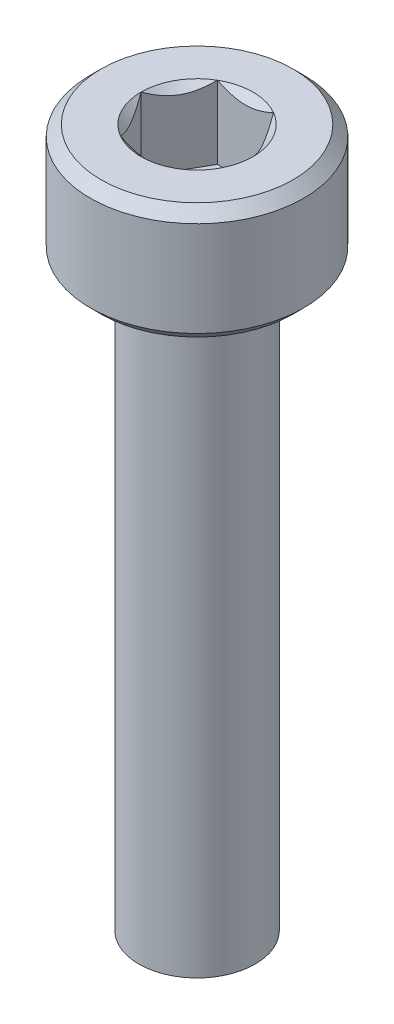
ISO-10303-21;
HEADER;
FILE_DESCRIPTION(('STEP AP214'),'2;1');
FILE_NAME('part.step','',(''),(''),'','','');
FILE_SCHEMA(('AUTOMOTIVE_DESIGN { 1 0 10303 214 1 1 1 1 }'));
ENDSEC;
DATA;
#1=APPLICATION_CONTEXT('core data for automotive mechanical design processes');
#2=APPLICATION_PROTOCOL_DEFINITION('international standard','automotive_design',2000,#1);
#3=PRODUCT_CONTEXT('',#1,'mechanical');
#4=PRODUCT('Part','Part','',(#3));
#5=PRODUCT_RELATED_PRODUCT_CATEGORY('part','',(#4));
#6=PRODUCT_DEFINITION_FORMATION('','',#4);
#7=PRODUCT_DEFINITION_CONTEXT('part definition',#1,'design');
#8=PRODUCT_DEFINITION('design','',#6,#7);
#9=PRODUCT_DEFINITION_SHAPE('','',#8);
#10=(LENGTH_UNIT() NAMED_UNIT(*) SI_UNIT(.MILLI.,.METRE.));
#11=(NAMED_UNIT(*) PLANE_ANGLE_UNIT() SI_UNIT($,.RADIAN.));
#12=(NAMED_UNIT(*) SI_UNIT($,.STERADIAN.) SOLID_ANGLE_UNIT());
#13=UNCERTAINTY_MEASURE_WITH_UNIT(LENGTH_MEASURE(1.E-05),#10,'distance_accuracy_value','');
#14=(GEOMETRIC_REPRESENTATION_CONTEXT(3) GLOBAL_UNCERTAINTY_ASSIGNED_CONTEXT((#13)) GLOBAL_UNIT_ASSIGNED_CONTEXT((#10,
#11,#12)) REPRESENTATION_CONTEXT('',''));
#15=CARTESIAN_POINT('',(0.,0.,0.));
#16=DIRECTION('',(0.,0.,1.));
#17=DIRECTION('',(1.,0.,0.));
#18=AXIS2_PLACEMENT_3D('',#15,#16,#17);
#19=CARTESIAN_POINT('',(0.,3.,0.));
#20=DIRECTION('',(0.,-1.,0.));
#21=DIRECTION('',(0.,0.,1.));
#22=AXIS2_PLACEMENT_3D('',#19,#20,#21);
#23=CYLINDRICAL_SURFACE('',#22,2.75);
#24=CARTESIAN_POINT('',(0.,0.275000000000001,0.));
#25=DIRECTION('',(0.,-1.,0.));
#26=DIRECTION('',(0.,0.,-1.));
#27=AXIS2_PLACEMENT_3D('',#24,#25,#26);
#28=CIRCLE('',#27,2.75);
#29=CARTESIAN_POINT('',(0.,0.275000000000001,-2.75));
#30=VERTEX_POINT('',#29);
#31=EDGE_CURVE('E177',#30,#30,#28,.T.);
#32=ORIENTED_EDGE('',*,*,#31,.F.);
#33=EDGE_LOOP('',(#32));
#34=FACE_BOUND('',#33,.T.);
#35=CARTESIAN_POINT('',(0.,2.725,0.));
#36=DIRECTION('',(0.,-1.,0.));
#37=DIRECTION('',(0.,0.,-1.));
#38=AXIS2_PLACEMENT_3D('',#35,#36,#37);
#39=CIRCLE('',#38,2.75);
#40=CARTESIAN_POINT('',(0.,2.725,-2.75));
#41=VERTEX_POINT('',#40);
#42=EDGE_CURVE('E120',#41,#41,#39,.F.);
#43=ORIENTED_EDGE('',*,*,#42,.F.);
#44=EDGE_LOOP('',(#43));
#45=FACE_BOUND('',#44,.T.);
#46=ADVANCED_FACE('F37',(#34,#45),#23,.T.);
#47=CARTESIAN_POINT('',(0.,3.,0.));
#48=DIRECTION('',(0.,1.,0.));
#49=DIRECTION('',(0.,0.,-1.));
#50=AXIS2_PLACEMENT_3D('',#47,#48,#49);
#51=PLANE('',#50);
#52=CARTESIAN_POINT('',(0.,3.,0.));
#53=DIRECTION('',(0.,-1.,0.));
#54=DIRECTION('',(0.,0.,-1.));
#55=AXIS2_PLACEMENT_3D('',#52,#53,#54);
#56=CIRCLE('',#55,2.475);
#57=CARTESIAN_POINT('',(0.,3.,-2.475));
#58=VERTEX_POINT('',#57);
#59=EDGE_CURVE('E41',#58,#58,#56,.T.);
#60=ORIENTED_EDGE('',*,*,#59,.F.);
#61=EDGE_LOOP('',(#60));
#62=FACE_BOUND('',#61,.T.);
#63=CARTESIAN_POINT('',(0.,3.,0.));
#64=DIRECTION('',(0.,-1.,0.));
#65=DIRECTION('',(0.,0.,-1.));
#66=AXIS2_PLACEMENT_3D('',#63,#64,#65);
#67=CIRCLE('',#66,1.44337567297406);
#68=CARTESIAN_POINT('',(0.721687836487033,3.,-1.25));
#69=VERTEX_POINT('',#68);
#70=CARTESIAN_POINT('',(1.44337567297406,3.,0.));
#71=VERTEX_POINT('',#70);
#72=EDGE_CURVE('E132',#69,#71,#67,.T.);
#73=ORIENTED_EDGE('',*,*,#72,.T.);
#74=CARTESIAN_POINT('',(0.721687836487032,3.,1.25));
#75=VERTEX_POINT('',#74);
#76=EDGE_CURVE('E109',#71,#75,#67,.T.);
#77=ORIENTED_EDGE('',*,*,#76,.T.);
#78=CARTESIAN_POINT('',(-0.721687836487033,3.,1.25));
#79=VERTEX_POINT('',#78);
#80=EDGE_CURVE('E123',#75,#79,#67,.T.);
#81=ORIENTED_EDGE('',*,*,#80,.T.);
#82=CARTESIAN_POINT('',(-1.44337567297406,3.,0.));
#83=VERTEX_POINT('',#82);
#84=EDGE_CURVE('E127',#79,#83,#67,.T.);
#85=ORIENTED_EDGE('',*,*,#84,.T.);
#86=CARTESIAN_POINT('',(-0.721687836487033,3.,-1.25));
#87=VERTEX_POINT('',#86);
#88=EDGE_CURVE('E263',#83,#87,#67,.T.);
#89=ORIENTED_EDGE('',*,*,#88,.T.);
#90=EDGE_CURVE('E134',#87,#69,#67,.T.);
#91=ORIENTED_EDGE('',*,*,#90,.T.);
#92=EDGE_LOOP('',(#73,#77,#81,#85,#89,#91));
#93=FACE_BOUND('',#92,.T.);
#94=ADVANCED_FACE('F129',(#62,#93),#51,.T.);
#95=CARTESIAN_POINT('',(0.,0.,0.));
#96=DIRECTION('',(0.,1.,0.));
#97=DIRECTION('',(0.,0.,-1.));
#98=AXIS2_PLACEMENT_3D('',#95,#96,#97);
#99=PLANE('',#98);
#100=CARTESIAN_POINT('',(0.,0.,0.));
#101=DIRECTION('',(0.,1.,0.));
#102=DIRECTION('',(0.,0.,1.));
#103=AXIS2_PLACEMENT_3D('',#100,#101,#102);
#104=CIRCLE('',#103,1.5);
#105=CARTESIAN_POINT('',(0.,0.,1.5));
#106=VERTEX_POINT('',#105);
#107=EDGE_CURVE('E11',#106,#106,#104,.T.);
#108=ORIENTED_EDGE('',*,*,#107,.T.);
#109=EDGE_LOOP('',(#108));
#110=FACE_BOUND('',#109,.T.);
#111=CARTESIAN_POINT('',(0.,0.,0.));
#112=DIRECTION('',(0.,-1.,0.));
#113=DIRECTION('',(0.,0.,-1.));
#114=AXIS2_PLACEMENT_3D('',#111,#112,#113);
#115=CIRCLE('',#114,2.475);
#116=CARTESIAN_POINT('',(0.,0.,-2.475));
#117=VERTEX_POINT('',#116);
#118=EDGE_CURVE('E179',#117,#117,#115,.F.);
#119=ORIENTED_EDGE('',*,*,#118,.F.);
#120=EDGE_LOOP('',(#119));
#121=FACE_BOUND('',#120,.T.);
#122=ADVANCED_FACE('F188',(#110,#121),#99,.F.);
#123=CARTESIAN_POINT('',(0.,3.,0.));
#124=DIRECTION('',(0.,1.,0.));
#125=DIRECTION('',(0.,0.,-1.));
#126=AXIS2_PLACEMENT_3D('',#123,#124,#125);
#127=CONICAL_SURFACE('',#126,1.44337567297406,0.78539816339745);
#128=ORIENTED_EDGE('',*,*,#80,.F.);
#129=CARTESIAN_POINT('',(-1.43934010808077,3.46298209689233,1.25));
#130=CARTESIAN_POINT('',(-1.40429313005659,3.43652492263289,1.25));
#131=CARTESIAN_POINT('',(-1.36905087135599,3.41032716035428,1.25));
#132=CARTESIAN_POINT('',(-1.29809650706311,3.35855757183958,1.25));
#133=CARTESIAN_POINT('',(-1.26238428576495,3.33298590435629,1.25));
#134=CARTESIAN_POINT('',(-1.15390111792708,3.25700599368946,1.25));
#135=CARTESIAN_POINT('',(-1.08031646726264,3.20774028618957,1.25));
#136=CARTESIAN_POINT('',(-0.926012322755095,3.11102583026313,1.25));
#137=CARTESIAN_POINT('',(-0.845125318656146,3.0638412989418,1.25));
#138=CARTESIAN_POINT('',(-0.679311174076602,2.97753073439041,1.25));
#139=CARTESIAN_POINT('',(-0.594398891026688,2.9383775346269,1.25));
#140=CARTESIAN_POINT('',(-0.466944812460741,2.89047722368829,1.25));
#141=CARTESIAN_POINT('',(-0.426289985812822,2.87672948978634,1.25));
#142=CARTESIAN_POINT('',(-0.343998850091268,2.85249792745054,1.25));
#143=CARTESIAN_POINT('',(-0.302362473614962,2.84201432386977,1.25));
#144=CARTESIAN_POINT('',(-0.219052696285666,2.8250301617483,1.25));
#145=CARTESIAN_POINT('',(-0.1773934284745,2.81846136047137,1.25));
#146=CARTESIAN_POINT('',(-0.0936293693401924,2.80943505345776,1.25));
#147=CARTESIAN_POINT('',(-0.0515246558543963,2.80697684099727,1.25));
#148=CARTESIAN_POINT('',(0.0311890576306314,2.80635406201328,1.25));
#149=CARTESIAN_POINT('',(0.0717969625499302,2.80803711684625,1.25));
#150=CARTESIAN_POINT('',(0.152668636885197,2.81526827059791,1.25));
#151=CARTESIAN_POINT('',(0.192932338835358,2.82081711041311,1.25));
#152=CARTESIAN_POINT('',(0.273499879165295,2.83557103646495,1.25));
#153=CARTESIAN_POINT('',(0.313792180618511,2.8448381759641,1.25));
#154=CARTESIAN_POINT('',(0.393496413911457,2.86653617845735,1.25));
#155=CARTESIAN_POINT('',(0.432908419115059,2.87896677673064,1.25));
#156=CARTESIAN_POINT('',(0.556992735862298,2.92277935293144,1.25));
#157=CARTESIAN_POINT('',(0.639898924666085,2.95915107287596,1.25));
#158=CARTESIAN_POINT('',(0.801816555499701,3.04001916217833,1.25));
#159=CARTESIAN_POINT('',(0.880812666325045,3.08454472091199,1.25));
#160=CARTESIAN_POINT('',(1.0317856127975,3.17640487666662,1.25));
#161=CARTESIAN_POINT('',(1.10391618485086,3.22348993391625,1.25));
#162=CARTESIAN_POINT('',(1.21018606043311,3.29627856159854,1.25));
#163=CARTESIAN_POINT('',(1.24515069969379,3.32079808539336,1.25));
#164=CARTESIAN_POINT('',(1.31460220852736,3.37048563676568,1.25));
#165=CARTESIAN_POINT('',(1.34908920596618,3.39565348541552,1.25));
#166=CARTESIAN_POINT('',(1.38337731682912,3.42109014884121,1.25));
#167=B_SPLINE_CURVE_WITH_KNOTS('',3,(#129,#130,#131,#132,#133,#134,#135,#136,#137,#138,#139,
#140,#141,#142,#143,#144,#145,#146,#147,#148,#149,#150,#151,#152,#153,#154,#155,#156,#157,#158,
#159,#160,#161,#162,#163,#164,#165,#166),.UNSPECIFIED.,.F.,.F.,(4,2,2,2,2,2,2,2,2,2,2,2,2,2,2,2,
2,2,4),(0.,0.131732960381448,0.263498984161645,0.529042014455825,0.809741926134617,
1.08947609717225,1.21811634272576,1.346765447839,1.47310084517844,1.59941451973784,
1.72115042167849,1.84290966131735,1.96679153905341,2.09066305366039,2.36146692896009,
2.63325989198491,2.89154668212279,3.01965734507713,3.14773302245628),.UNSPECIFIED.);
#168=EDGE_CURVE('E114',#75,#79,#167,.F.);
#169=ORIENTED_EDGE('',*,*,#168,.T.);
#170=EDGE_LOOP('',(#128,#169));
#171=FACE_BOUND('',#170,.T.);
#172=ADVANCED_FACE('F124',(#171),#127,.F.);
#173=ORIENTED_EDGE('',*,*,#84,.F.);
#174=CARTESIAN_POINT('',(-0.721572366433195,3.00011548390914,1.2502));
#175=CARTESIAN_POINT('',(-0.746384090710444,2.9753216680551,1.20722483292841));
#176=CARTESIAN_POINT('',(-0.771610739653664,2.95198373441868,1.16353099525405));
#177=CARTESIAN_POINT('',(-0.823050873919155,2.90925200408454,1.07443406915806));
#178=CARTESIAN_POINT('',(-0.849269254648333,2.88988199236041,1.02902250164294));
#179=CARTESIAN_POINT('',(-0.902137405038635,2.85670048341348,0.937452179064741));
#180=CARTESIAN_POINT('',(-0.928773701756387,2.84280555905266,0.891316759824115));
#181=CARTESIAN_POINT('',(-0.982632884076012,2.82139728216064,0.798029919592408));
#182=CARTESIAN_POINT('',(-1.00985412292348,2.81386794156679,0.750881350863621));
#183=CARTESIAN_POINT('',(-1.05676666578643,2.8070744980507,0.669626443112748));
#184=CARTESIAN_POINT('',(-1.07639733689152,2.80606855910435,0.63562512337206));
#185=CARTESIAN_POINT('',(-1.11562418145499,2.80776141491132,0.567682235567523));
#186=CARTESIAN_POINT('',(-1.1352203463451,2.81046102721554,0.533740682344343));
#187=CARTESIAN_POINT('',(-1.1742235548576,2.81940893031638,0.466185143542501));
#188=CARTESIAN_POINT('',(-1.19363040521233,2.82566052589971,0.432571492713226));
#189=CARTESIAN_POINT('',(-1.23212011385119,2.8413756814139,0.365905361782188));
#190=CARTESIAN_POINT('',(-1.2512028293628,2.85084062008746,0.332853128969705));
#191=CARTESIAN_POINT('',(-1.30007715810653,2.87893139068759,0.248200308399736));
#192=CARTESIAN_POINT('',(-1.32956058931202,2.8996701574522,0.197133507570362));
#193=CARTESIAN_POINT('',(-1.38737318998519,2.94638713467148,0.0969991458867452));
#194=CARTESIAN_POINT('',(-1.41570576386268,2.97234829594677,0.0479256884217304));
#195=CARTESIAN_POINT('',(-1.4434911430279,3.00011548390914,-0.000200000000000358));
#196=B_SPLINE_CURVE_WITH_KNOTS('',3,(#174,#175,#176,#177,#178,#179,#180,#181,#182,#183,#184,
#185,#186,#187,#188,#189,#190,#191,#192,#193,#194,#195),.UNSPECIFIED.,.F.,.F.,(4,2,2,2,2,2,2,2,
2,2,4),(0.,0.166533409618303,0.334037607289761,0.498880396489697,0.663307919240274,
0.780963963458826,0.898645970148452,1.01643764860773,1.13427993171549,1.32148652032141,
1.50809158792574),.UNSPECIFIED.);
#197=EDGE_CURVE('E133',#79,#83,#196,.T.);
#198=ORIENTED_EDGE('',*,*,#197,.T.);
#199=EDGE_LOOP('',(#173,#198));
#200=FACE_BOUND('',#199,.T.);
#201=ADVANCED_FACE('F261',(#200),#127,.F.);
#202=ORIENTED_EDGE('',*,*,#88,.F.);
#203=CARTESIAN_POINT('',(-1.4434911430279,3.00011548390914,0.000199999999999785));
#204=CARTESIAN_POINT('',(-1.41867941875065,2.9753216680551,-0.0427751670715869));
#205=CARTESIAN_POINT('',(-1.39345276980743,2.95198373441868,-0.0864690047459481));
#206=CARTESIAN_POINT('',(-1.34201263554194,2.90925200408454,-0.175565930841942));
#207=CARTESIAN_POINT('',(-1.31579425481276,2.88988199236041,-0.220977498357064));
#208=CARTESIAN_POINT('',(-1.26292610442246,2.85670048341348,-0.31254782093526));
#209=CARTESIAN_POINT('',(-1.23628980770471,2.84280555905266,-0.358683240175886));
#210=CARTESIAN_POINT('',(-1.18243062538508,2.82139728216064,-0.451970080407593));
#211=CARTESIAN_POINT('',(-1.15520938653761,2.81386794156679,-0.49911864913638));
#212=CARTESIAN_POINT('',(-1.10829684367467,2.8070744980507,-0.580373556887253));
#213=CARTESIAN_POINT('',(-1.08866617256958,2.80606855910435,-0.614374876627941));
#214=CARTESIAN_POINT('',(-1.04943932800611,2.80776141491132,-0.682317764432478));
#215=CARTESIAN_POINT('',(-1.02984316311599,2.81046102721554,-0.716259317655658));
#216=CARTESIAN_POINT('',(-0.990839954603499,2.81940893031638,-0.7838148564575));
#217=CARTESIAN_POINT('',(-0.971433104248771,2.82566052589971,-0.817428507286775));
#218=CARTESIAN_POINT('',(-0.932943395609905,2.8413756814139,-0.884094638217813));
#219=CARTESIAN_POINT('',(-0.9138606800983,2.85084062008746,-0.917146871030296));
#220=CARTESIAN_POINT('',(-0.864986351354568,2.87893139068759,-1.00179969160026));
#221=CARTESIAN_POINT('',(-0.835502920149076,2.8996701574522,-1.05286649242964));
#222=CARTESIAN_POINT('',(-0.777690319475909,2.94638713467148,-1.15300085411325));
#223=CARTESIAN_POINT('',(-0.749357745598417,2.97234829594677,-1.20207431157827));
#224=CARTESIAN_POINT('',(-0.721572366433195,3.00011548390914,-1.2502));
#225=B_SPLINE_CURVE_WITH_KNOTS('',3,(#203,#204,#205,#206,#207,#208,#209,#210,#211,#212,#213,
#214,#215,#216,#217,#218,#219,#220,#221,#222,#223,#224),.UNSPECIFIED.,.F.,.F.,(4,2,2,2,2,2,2,2,
2,2,4),(0.,0.166533409618303,0.334037607289761,0.498880396489698,0.663307919240275,
0.780963963458827,0.898645970148453,1.01643764860773,1.1342799317155,1.32148652032141,
1.50809158792573),.UNSPECIFIED.);
#226=EDGE_CURVE('E145',#83,#87,#225,.T.);
#227=ORIENTED_EDGE('',*,*,#226,.T.);
#228=EDGE_LOOP('',(#202,#227));
#229=FACE_BOUND('',#228,.T.);
#230=ADVANCED_FACE('F264',(#229),#127,.F.);
#231=ORIENTED_EDGE('',*,*,#90,.F.);
#232=CARTESIAN_POINT('',(-1.43934010808077,3.46298209689233,-1.25));
#233=CARTESIAN_POINT('',(-1.40429313005659,3.43652492263289,-1.25));
#234=CARTESIAN_POINT('',(-1.36905087135599,3.41032716035428,-1.25));
#235=CARTESIAN_POINT('',(-1.29809650706311,3.35855757183958,-1.25));
#236=CARTESIAN_POINT('',(-1.26238428576495,3.33298590435629,-1.25));
#237=CARTESIAN_POINT('',(-1.15390111792708,3.25700599368946,-1.25));
#238=CARTESIAN_POINT('',(-1.08031646726264,3.20774028618957,-1.25));
#239=CARTESIAN_POINT('',(-0.926012322755096,3.11102583026313,-1.25));
#240=CARTESIAN_POINT('',(-0.845125318656147,3.0638412989418,-1.25));
#241=CARTESIAN_POINT('',(-0.679311174076603,2.97753073439041,-1.25));
#242=CARTESIAN_POINT('',(-0.594398891026688,2.9383775346269,-1.25));
#243=CARTESIAN_POINT('',(-0.46694481246074,2.89047722368829,-1.25));
#244=CARTESIAN_POINT('',(-0.426289985812822,2.87672948978634,-1.25));
#245=CARTESIAN_POINT('',(-0.343998850091268,2.85249792745054,-1.25));
#246=CARTESIAN_POINT('',(-0.302362473614962,2.84201432386977,-1.25));
#247=CARTESIAN_POINT('',(-0.219052696285665,2.8250301617483,-1.25));
#248=CARTESIAN_POINT('',(-0.1773934284745,2.81846136047137,-1.25));
#249=CARTESIAN_POINT('',(-0.0936293693401921,2.80943505345776,-1.25));
#250=CARTESIAN_POINT('',(-0.051524655854396,2.80697684099727,-1.25));
#251=CARTESIAN_POINT('',(0.0311890576306315,2.80635406201328,-1.25));
#252=CARTESIAN_POINT('',(0.0717969625499303,2.80803711684625,-1.25));
#253=CARTESIAN_POINT('',(0.152668636885197,2.81526827059791,-1.25));
#254=CARTESIAN_POINT('',(0.192932338835358,2.82081711041311,-1.25));
#255=CARTESIAN_POINT('',(0.273499879165295,2.83557103646495,-1.25));
#256=CARTESIAN_POINT('',(0.313792180618511,2.8448381759641,-1.25));
#257=CARTESIAN_POINT('',(0.393496413911457,2.86653617845735,-1.25));
#258=CARTESIAN_POINT('',(0.432908419115059,2.87896677673064,-1.25));
#259=CARTESIAN_POINT('',(0.556992735862298,2.92277935293144,-1.25));
#260=CARTESIAN_POINT('',(0.639898924666085,2.95915107287595,-1.25));
#261=CARTESIAN_POINT('',(0.801816555499701,3.04001916217833,-1.25));
#262=CARTESIAN_POINT('',(0.880812666325044,3.08454472091198,-1.25));
#263=CARTESIAN_POINT('',(1.0317856127975,3.17640487666662,-1.25));
#264=CARTESIAN_POINT('',(1.10391618485086,3.22348993391625,-1.25));
#265=CARTESIAN_POINT('',(1.2101860604331,3.29627856159854,-1.25));
#266=CARTESIAN_POINT('',(1.24515069969379,3.32079808539336,-1.25));
#267=CARTESIAN_POINT('',(1.31460220852736,3.37048563676568,-1.25));
#268=CARTESIAN_POINT('',(1.34908920596618,3.39565348541552,-1.25));
#269=CARTESIAN_POINT('',(1.38337731682911,3.42109014884121,-1.25));
#270=B_SPLINE_CURVE_WITH_KNOTS('',3,(#232,#233,#234,#235,#236,#237,#238,#239,#240,#241,#242,
#243,#244,#245,#246,#247,#248,#249,#250,#251,#252,#253,#254,#255,#256,#257,#258,#259,#260,#261,
#262,#263,#264,#265,#266,#267,#268,#269),.UNSPECIFIED.,.F.,.F.,(4,2,2,2,2,2,2,2,2,2,2,2,2,2,2,2,
2,2,4),(0.,0.131732960381448,0.263498984161645,0.529042014455826,0.809741926134619,
1.08947609717225,1.21811634272577,1.34676544783901,1.47310084517844,1.59941451973785,
1.7211504216785,1.84290966131735,1.96679153905342,2.09066305366039,2.36146692896009,
2.63325989198491,2.89154668212279,3.01965734507713,3.14773302245628),.UNSPECIFIED.);
#271=EDGE_CURVE('E225',#87,#69,#270,.T.);
#272=ORIENTED_EDGE('',*,*,#271,.T.);
#273=EDGE_LOOP('',(#231,#272));
#274=FACE_BOUND('',#273,.T.);
#275=ADVANCED_FACE('F345',(#274),#127,.F.);
#276=ORIENTED_EDGE('',*,*,#72,.F.);
#277=CARTESIAN_POINT('',(0.721572366433194,3.00011548390914,-1.2502));
#278=CARTESIAN_POINT('',(0.746384090710444,2.9753216680551,-1.20722483292841));
#279=CARTESIAN_POINT('',(0.771610739653664,2.95198373441868,-1.16353099525405));
#280=CARTESIAN_POINT('',(0.823050873919154,2.90925200408454,-1.07443406915806));
#281=CARTESIAN_POINT('',(0.849269254648333,2.88988199236041,-1.02902250164294));
#282=CARTESIAN_POINT('',(0.902137405038635,2.85670048341348,-0.93745217906474));
#283=CARTESIAN_POINT('',(0.928773701756386,2.84280555905266,-0.891316759824115));
#284=CARTESIAN_POINT('',(0.982632884076012,2.82139728216064,-0.798029919592408));
#285=CARTESIAN_POINT('',(1.00985412292348,2.81386794156679,-0.750881350863621));
#286=CARTESIAN_POINT('',(1.05676666578643,2.8070744980507,-0.669626443112748));
#287=CARTESIAN_POINT('',(1.07639733689152,2.80606855910435,-0.63562512337206));
#288=CARTESIAN_POINT('',(1.11562418145499,2.80776141491132,-0.567682235567523));
#289=CARTESIAN_POINT('',(1.1352203463451,2.81046102721554,-0.533740682344343));
#290=CARTESIAN_POINT('',(1.1742235548576,2.81940893031638,-0.466185143542501));
#291=CARTESIAN_POINT('',(1.19363040521232,2.8256605258997,-0.432571492713226));
#292=CARTESIAN_POINT('',(1.23212011385119,2.8413756814139,-0.365905361782188));
#293=CARTESIAN_POINT('',(1.2512028293628,2.85084062008746,-0.332853128969705));
#294=CARTESIAN_POINT('',(1.30007715810653,2.87893139068759,-0.248200308399736));
#295=CARTESIAN_POINT('',(1.32956058931202,2.8996701574522,-0.197133507570362));
#296=CARTESIAN_POINT('',(1.38737318998519,2.94638713467148,-0.096999145886745));
#297=CARTESIAN_POINT('',(1.41570576386268,2.97234829594677,-0.04792568842173));
#298=CARTESIAN_POINT('',(1.4434911430279,3.00011548390914,0.000200000000000782));
#299=B_SPLINE_CURVE_WITH_KNOTS('',3,(#277,#278,#279,#280,#281,#282,#283,#284,#285,#286,#287,
#288,#289,#290,#291,#292,#293,#294,#295,#296,#297,#298),.UNSPECIFIED.,.F.,.F.,(4,2,2,2,2,2,2,2,
2,2,4),(0.,0.166533409618303,0.334037607289761,0.498880396489697,0.663307919240274,
0.780963963458826,0.898645970148452,1.01643764860773,1.13427993171549,1.32148652032141,
1.50809158792574),.UNSPECIFIED.);
#300=EDGE_CURVE('E111',#69,#71,#299,.T.);
#301=ORIENTED_EDGE('',*,*,#300,.T.);
#302=EDGE_LOOP('',(#276,#301));
#303=FACE_BOUND('',#302,.T.);
#304=ADVANCED_FACE('F337',(#303),#127,.F.);
#305=ORIENTED_EDGE('',*,*,#76,.F.);
#306=CARTESIAN_POINT('',(1.4434911430279,3.00011548390914,-0.000199999999999333));
#307=CARTESIAN_POINT('',(1.41867941875065,2.9753216680551,0.0427751670715874));
#308=CARTESIAN_POINT('',(1.39345276980743,2.95198373441868,0.0864690047459486));
#309=CARTESIAN_POINT('',(1.34201263554194,2.90925200408454,0.175565930841942));
#310=CARTESIAN_POINT('',(1.31579425481276,2.88988199236041,0.220977498357064));
#311=CARTESIAN_POINT('',(1.26292610442246,2.85670048341348,0.31254782093526));
#312=CARTESIAN_POINT('',(1.23628980770471,2.84280555905266,0.358683240175886));
#313=CARTESIAN_POINT('',(1.18243062538508,2.82139728216064,0.451970080407593));
#314=CARTESIAN_POINT('',(1.15520938653761,2.81386794156679,0.49911864913638));
#315=CARTESIAN_POINT('',(1.10829684367467,2.8070744980507,0.580373556887252));
#316=CARTESIAN_POINT('',(1.08866617256958,2.80606855910435,0.614374876627941));
#317=CARTESIAN_POINT('',(1.04943932800611,2.80776141491132,0.682317764432477));
#318=CARTESIAN_POINT('',(1.02984316311599,2.81046102721554,0.716259317655657));
#319=CARTESIAN_POINT('',(0.990839954603499,2.81940893031638,0.783814856457499));
#320=CARTESIAN_POINT('',(0.971433104248771,2.82566052589971,0.817428507286775));
#321=CARTESIAN_POINT('',(0.932943395609905,2.8413756814139,0.884094638217813));
#322=CARTESIAN_POINT('',(0.9138606800983,2.85084062008746,0.917146871030295));
#323=CARTESIAN_POINT('',(0.864986351354567,2.87893139068759,1.00179969160026));
#324=CARTESIAN_POINT('',(0.835502920149075,2.8996701574522,1.05286649242964));
#325=CARTESIAN_POINT('',(0.777690319475908,2.94638713467148,1.15300085411326));
#326=CARTESIAN_POINT('',(0.749357745598416,2.97234829594677,1.20207431157827));
#327=CARTESIAN_POINT('',(0.721572366433194,3.00011548390914,1.2502));
#328=B_SPLINE_CURVE_WITH_KNOTS('',3,(#306,#307,#308,#309,#310,#311,#312,#313,#314,#315,#316,
#317,#318,#319,#320,#321,#322,#323,#324,#325,#326,#327),.UNSPECIFIED.,.F.,.F.,(4,2,2,2,2,2,2,2,
2,2,4),(0.,0.166533409618303,0.334037607289761,0.498880396489698,0.663307919240274,
0.780963963458826,0.898645970148452,1.01643764860773,1.13427993171549,1.32148652032141,
1.50809158792574),.UNSPECIFIED.);
#329=EDGE_CURVE('E94',#71,#75,#328,.T.);
#330=ORIENTED_EDGE('',*,*,#329,.T.);
#331=EDGE_LOOP('',(#305,#330));
#332=FACE_BOUND('',#331,.T.);
#333=ADVANCED_FACE('F107',(#332),#127,.F.);
#334=CARTESIAN_POINT('',(0.,1.12,0.));
#335=DIRECTION('',(0.,1.,0.));
#336=DIRECTION('',(0.,0.,-1.));
#337=AXIS2_PLACEMENT_3D('',#334,#335,#336);
#338=PLANE('',#337);
#339=DIRECTION('',(-0.5,0.,0.866025403784438));
#340=VECTOR('',#339,1.);
#341=CARTESIAN_POINT('',(1.44337567297406,1.12,0.));
#342=LINE('',#341,#340);
#343=CARTESIAN_POINT('',(1.44337567297406,1.12,0.));
#344=VERTEX_POINT('',#343);
#345=CARTESIAN_POINT('',(0.721687836487032,1.12,1.25));
#346=VERTEX_POINT('',#345);
#347=EDGE_CURVE('E97',#344,#346,#342,.T.);
#348=ORIENTED_EDGE('',*,*,#347,.F.);
#349=DIRECTION('',(0.5,0.,0.866025403784439));
#350=VECTOR('',#349,1.);
#351=CARTESIAN_POINT('',(0.721687836487032,1.12,-1.25));
#352=LINE('',#351,#350);
#353=CARTESIAN_POINT('',(0.721687836487032,1.12,-1.25));
#354=VERTEX_POINT('',#353);
#355=EDGE_CURVE('E103',#354,#344,#352,.T.);
#356=ORIENTED_EDGE('',*,*,#355,.F.);
#357=DIRECTION('',(1.,0.,0.));
#358=VECTOR('',#357,1.);
#359=CARTESIAN_POINT('',(-0.721687836487033,1.12,-1.25));
#360=LINE('',#359,#358);
#361=CARTESIAN_POINT('',(-0.721687836487033,1.12,-1.25));
#362=VERTEX_POINT('',#361);
#363=EDGE_CURVE('E244',#362,#354,#360,.T.);
#364=ORIENTED_EDGE('',*,*,#363,.F.);
#365=DIRECTION('',(0.5,0.,-0.866025403784439));
#366=VECTOR('',#365,1.);
#367=CARTESIAN_POINT('',(-1.44337567297406,1.12,0.));
#368=LINE('',#367,#366);
#369=CARTESIAN_POINT('',(-1.44337567297406,1.12,0.));
#370=VERTEX_POINT('',#369);
#371=EDGE_CURVE('E241',#370,#362,#368,.T.);
#372=ORIENTED_EDGE('',*,*,#371,.F.);
#373=DIRECTION('',(-0.5,0.,-0.866025403784439));
#374=VECTOR('',#373,1.);
#375=CARTESIAN_POINT('',(-0.721687836487032,1.12,1.25));
#376=LINE('',#375,#374);
#377=CARTESIAN_POINT('',(-0.721687836487032,1.12,1.25));
#378=VERTEX_POINT('',#377);
#379=EDGE_CURVE('E238',#378,#370,#376,.T.);
#380=ORIENTED_EDGE('',*,*,#379,.F.);
#381=DIRECTION('',(-1.,0.,0.));
#382=VECTOR('',#381,1.);
#383=CARTESIAN_POINT('',(0.721687836487032,1.12,1.25));
#384=LINE('',#383,#382);
#385=EDGE_CURVE('E236',#346,#378,#384,.T.);
#386=ORIENTED_EDGE('',*,*,#385,.F.);
#387=EDGE_LOOP('',(#348,#356,#364,#372,#380,#386));
#388=FACE_BOUND('',#387,.T.);
#389=ADVANCED_FACE('F166',(#388),#338,.T.);
#390=CARTESIAN_POINT('',(0.721687836487032,1.12,1.25));
#391=DIRECTION('',(0.,0.,1.));
#392=DIRECTION('',(-1.,0.,0.));
#393=AXIS2_PLACEMENT_3D('',#390,#391,#392);
#394=PLANE('',#393);
#395=DIRECTION('',(0.,1.,0.));
#396=VECTOR('',#395,1.);
#397=CARTESIAN_POINT('',(0.721687836487032,1.12,1.25));
#398=LINE('',#397,#396);
#399=EDGE_CURVE('E91',#346,#75,#398,.T.);
#400=ORIENTED_EDGE('',*,*,#399,.F.);
#401=ORIENTED_EDGE('',*,*,#385,.T.);
#402=DIRECTION('',(0.,1.,0.));
#403=VECTOR('',#402,1.);
#404=CARTESIAN_POINT('',(-0.721687836487032,1.12,1.25));
#405=LINE('',#404,#403);
#406=EDGE_CURVE('E102',#378,#79,#405,.T.);
#407=ORIENTED_EDGE('',*,*,#406,.T.);
#408=ORIENTED_EDGE('',*,*,#168,.F.);
#409=EDGE_LOOP('',(#400,#401,#407,#408));
#410=FACE_BOUND('',#409,.T.);
#411=ADVANCED_FACE('F116',(#410),#394,.F.);
#412=CARTESIAN_POINT('',(-0.721687836487032,1.12,1.25));
#413=DIRECTION('',(-0.866025403784439,0.,0.5));
#414=DIRECTION('',(-0.5,0.,-0.866025403784439));
#415=AXIS2_PLACEMENT_3D('',#412,#413,#414);
#416=PLANE('',#415);
#417=ORIENTED_EDGE('',*,*,#406,.F.);
#418=ORIENTED_EDGE('',*,*,#379,.T.);
#419=DIRECTION('',(0.,1.,0.));
#420=VECTOR('',#419,1.);
#421=CARTESIAN_POINT('',(-1.44337567297406,1.12,0.));
#422=LINE('',#421,#420);
#423=EDGE_CURVE('E251',#370,#83,#422,.T.);
#424=ORIENTED_EDGE('',*,*,#423,.T.);
#425=ORIENTED_EDGE('',*,*,#197,.F.);
#426=EDGE_LOOP('',(#417,#418,#424,#425));
#427=FACE_BOUND('',#426,.T.);
#428=ADVANCED_FACE('F155',(#427),#416,.F.);
#429=CARTESIAN_POINT('',(-1.44337567297406,1.12,0.));
#430=DIRECTION('',(-0.866025403784439,0.,-0.5));
#431=DIRECTION('',(0.5,0.,-0.866025403784439));
#432=AXIS2_PLACEMENT_3D('',#429,#430,#431);
#433=PLANE('',#432);
#434=ORIENTED_EDGE('',*,*,#423,.F.);
#435=ORIENTED_EDGE('',*,*,#371,.T.);
#436=DIRECTION('',(0.,1.,0.));
#437=VECTOR('',#436,1.);
#438=CARTESIAN_POINT('',(-0.721687836487033,1.12,-1.25));
#439=LINE('',#438,#437);
#440=EDGE_CURVE('E249',#362,#87,#439,.T.);
#441=ORIENTED_EDGE('',*,*,#440,.T.);
#442=ORIENTED_EDGE('',*,*,#226,.F.);
#443=EDGE_LOOP('',(#434,#435,#441,#442));
#444=FACE_BOUND('',#443,.T.);
#445=ADVANCED_FACE('F159',(#444),#433,.F.);
#446=CARTESIAN_POINT('',(-0.721687836487033,1.12,-1.25));
#447=DIRECTION('',(0.,0.,-1.));
#448=DIRECTION('',(1.,0.,0.));
#449=AXIS2_PLACEMENT_3D('',#446,#447,#448);
#450=PLANE('',#449);
#451=ORIENTED_EDGE('',*,*,#440,.F.);
#452=ORIENTED_EDGE('',*,*,#363,.T.);
#453=DIRECTION('',(0.,1.,0.));
#454=VECTOR('',#453,1.);
#455=CARTESIAN_POINT('',(0.721687836487032,1.12,-1.25));
#456=LINE('',#455,#454);
#457=EDGE_CURVE('E61',#354,#69,#456,.T.);
#458=ORIENTED_EDGE('',*,*,#457,.T.);
#459=ORIENTED_EDGE('',*,*,#271,.F.);
#460=EDGE_LOOP('',(#451,#452,#458,#459));
#461=FACE_BOUND('',#460,.T.);
#462=ADVANCED_FACE('F213',(#461),#450,.F.);
#463=CARTESIAN_POINT('',(0.721687836487032,1.12,-1.25));
#464=DIRECTION('',(0.866025403784439,0.,-0.5));
#465=DIRECTION('',(0.5,0.,0.866025403784439));
#466=AXIS2_PLACEMENT_3D('',#463,#464,#465);
#467=PLANE('',#466);
#468=ORIENTED_EDGE('',*,*,#457,.F.);
#469=ORIENTED_EDGE('',*,*,#355,.T.);
#470=DIRECTION('',(0.,1.,0.));
#471=VECTOR('',#470,1.);
#472=CARTESIAN_POINT('',(1.44337567297406,1.12,0.));
#473=LINE('',#472,#471);
#474=EDGE_CURVE('E53',#344,#71,#473,.T.);
#475=ORIENTED_EDGE('',*,*,#474,.T.);
#476=ORIENTED_EDGE('',*,*,#300,.F.);
#477=EDGE_LOOP('',(#468,#469,#475,#476));
#478=FACE_BOUND('',#477,.T.);
#479=ADVANCED_FACE('F205',(#478),#467,.F.);
#480=CARTESIAN_POINT('',(1.44337567297406,1.12,0.));
#481=DIRECTION('',(0.866025403784438,0.,0.5));
#482=DIRECTION('',(-0.5,0.,0.866025403784439));
#483=AXIS2_PLACEMENT_3D('',#480,#481,#482);
#484=PLANE('',#483);
#485=ORIENTED_EDGE('',*,*,#474,.F.);
#486=ORIENTED_EDGE('',*,*,#347,.T.);
#487=ORIENTED_EDGE('',*,*,#399,.T.);
#488=ORIENTED_EDGE('',*,*,#329,.F.);
#489=EDGE_LOOP('',(#485,#486,#487,#488));
#490=FACE_BOUND('',#489,.T.);
#491=ADVANCED_FACE('F93',(#490),#484,.F.);
#492=CARTESIAN_POINT('',(0.,0.275000000000001,0.));
#493=DIRECTION('',(0.,1.,0.));
#494=DIRECTION('',(0.,0.,-1.));
#495=AXIS2_PLACEMENT_3D('',#492,#493,#494);
#496=CONICAL_SURFACE('',#495,2.75,0.785398163397451);
#497=ORIENTED_EDGE('',*,*,#118,.T.);
#498=EDGE_LOOP('',(#497));
#499=FACE_BOUND('',#498,.T.);
#500=ORIENTED_EDGE('',*,*,#31,.T.);
#501=EDGE_LOOP('',(#500));
#502=FACE_BOUND('',#501,.T.);
#503=ADVANCED_FACE('F197',(#499,#502),#496,.T.);
#504=CARTESIAN_POINT('',(0.,3.,0.));
#505=DIRECTION('',(0.,-1.,0.));
#506=DIRECTION('',(0.,0.,1.));
#507=AXIS2_PLACEMENT_3D('',#504,#505,#506);
#508=CONICAL_SURFACE('',#507,2.475,0.785398163397447);
#509=ORIENTED_EDGE('',*,*,#42,.T.);
#510=EDGE_LOOP('',(#509));
#511=FACE_BOUND('',#510,.T.);
#512=ORIENTED_EDGE('',*,*,#59,.T.);
#513=EDGE_LOOP('',(#512));
#514=FACE_BOUND('',#513,.T.);
#515=ADVANCED_FACE('F39',(#511,#514),#508,.T.);
#516=CARTESIAN_POINT('',(0.,-15.,0.));
#517=DIRECTION('',(0.,1.,0.));
#518=DIRECTION('',(0.,0.,-1.));
#519=AXIS2_PLACEMENT_3D('',#516,#517,#518);
#520=CYLINDRICAL_SURFACE('',#519,1.5);
#521=CARTESIAN_POINT('',(0.,-15.,0.));
#522=DIRECTION('',(0.,1.,0.));
#523=DIRECTION('',(0.,0.,1.));
#524=AXIS2_PLACEMENT_3D('',#521,#522,#523);
#525=CIRCLE('',#524,1.5);
#526=CARTESIAN_POINT('',(0.,-15.,1.5));
#527=VERTEX_POINT('',#526);
#528=EDGE_CURVE('E265',#527,#527,#525,.T.);
#529=ORIENTED_EDGE('',*,*,#528,.T.);
#530=EDGE_LOOP('',(#529));
#531=FACE_BOUND('',#530,.T.);
#532=ORIENTED_EDGE('',*,*,#107,.F.);
#533=EDGE_LOOP('',(#532));
#534=FACE_BOUND('',#533,.T.);
#535=ADVANCED_FACE('F203',(#531,#534),#520,.T.);
#536=CARTESIAN_POINT('',(0.,-15.,0.));
#537=DIRECTION('',(0.,-1.,0.));
#538=DIRECTION('',(0.,0.,1.));
#539=AXIS2_PLACEMENT_3D('',#536,#537,#538);
#540=PLANE('',#539);
#541=ORIENTED_EDGE('',*,*,#528,.F.);
#542=EDGE_LOOP('',(#541));
#543=FACE_BOUND('',#542,.T.);
#544=ADVANCED_FACE('F271',(#543),#540,.T.);
#545=CLOSED_SHELL('',(#46,#94,#122,#172,#201,#230,#275,#304,#333,#389,#411,#428,#445,#462,#479,
#491,#503,#515,#535,#544));
#546=MANIFOLD_SOLID_BREP('B2',#545);
#547=ADVANCED_BREP_SHAPE_REPRESENTATION('',(#18,#546),#14);
#548=SHAPE_DEFINITION_REPRESENTATION(#9,#547);
ENDSEC;
END-ISO-10303-21;
